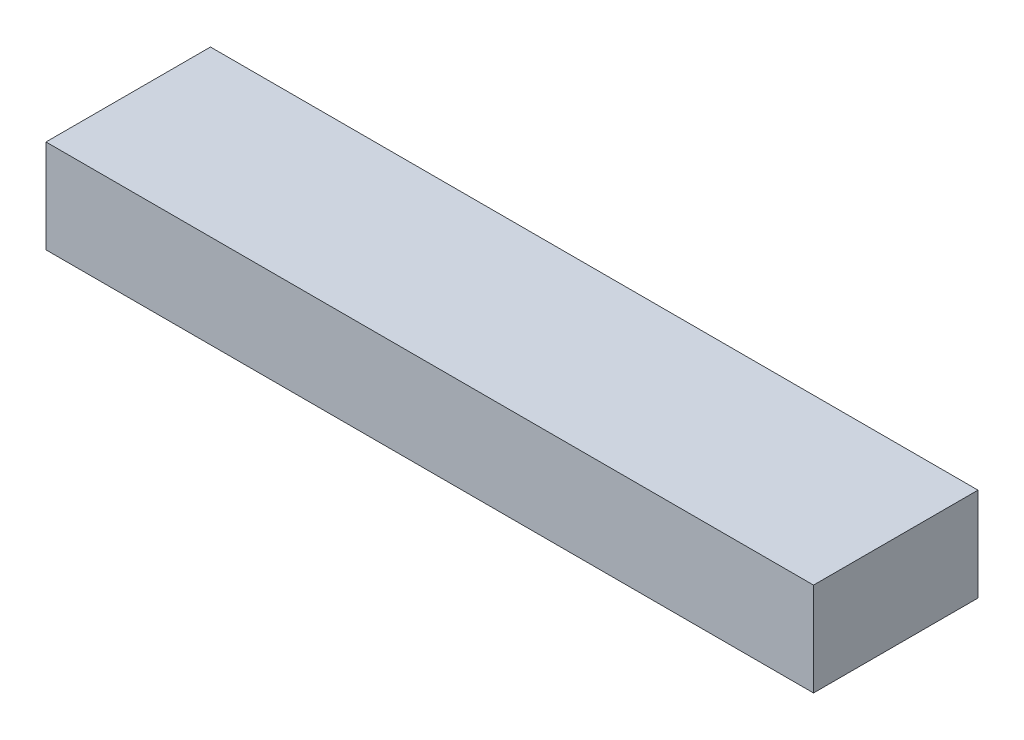
ISO-10303-21;
HEADER;
FILE_DESCRIPTION(('STEP AP214'),'2;1');
FILE_NAME('part.step','',(''),(''),'','','');
FILE_SCHEMA(('AUTOMOTIVE_DESIGN { 1 0 10303 214 1 1 1 1 }'));
ENDSEC;
DATA;
#1=APPLICATION_CONTEXT('core data for automotive mechanical design processes');
#2=APPLICATION_PROTOCOL_DEFINITION('international standard','automotive_design',2000,#1);
#3=PRODUCT_CONTEXT('',#1,'mechanical');
#4=PRODUCT('Part','Part','',(#3));
#5=PRODUCT_RELATED_PRODUCT_CATEGORY('part','',(#4));
#6=PRODUCT_DEFINITION_FORMATION('','',#4);
#7=PRODUCT_DEFINITION_CONTEXT('part definition',#1,'design');
#8=PRODUCT_DEFINITION('design','',#6,#7);
#9=PRODUCT_DEFINITION_SHAPE('','',#8);
#10=(LENGTH_UNIT() NAMED_UNIT(*) SI_UNIT(.MILLI.,.METRE.));
#11=(NAMED_UNIT(*) PLANE_ANGLE_UNIT() SI_UNIT($,.RADIAN.));
#12=(NAMED_UNIT(*) SI_UNIT($,.STERADIAN.) SOLID_ANGLE_UNIT());
#13=UNCERTAINTY_MEASURE_WITH_UNIT(LENGTH_MEASURE(1.E-05),#10,'distance_accuracy_value','');
#14=(GEOMETRIC_REPRESENTATION_CONTEXT(3) GLOBAL_UNCERTAINTY_ASSIGNED_CONTEXT((#13)) GLOBAL_UNIT_ASSIGNED_CONTEXT((#10,
#11,#12)) REPRESENTATION_CONTEXT('',''));
#15=CARTESIAN_POINT('',(0.,0.,0.));
#16=DIRECTION('',(0.,0.,1.));
#17=DIRECTION('',(1.,0.,0.));
#18=AXIS2_PLACEMENT_3D('',#15,#16,#17);
#19=CARTESIAN_POINT('',(355.6,0.,76.2));
#20=DIRECTION('',(0.,1.,0.));
#21=DIRECTION('',(-1.,0.,0.));
#22=AXIS2_PLACEMENT_3D('',#19,#20,#21);
#23=PLANE('',#22);
#24=DIRECTION('',(1.,0.,0.));
#25=VECTOR('',#24,1.);
#26=CARTESIAN_POINT('',(355.6,0.,0.));
#27=LINE('',#26,#25);
#28=CARTESIAN_POINT('',(0.,0.,0.));
#29=VERTEX_POINT('',#28);
#30=CARTESIAN_POINT('',(355.6,0.,0.));
#31=VERTEX_POINT('',#30);
#32=EDGE_CURVE('E100',#29,#31,#27,.T.);
#33=ORIENTED_EDGE('',*,*,#32,.T.);
#34=DIRECTION('',(0.,0.,-1.));
#35=VECTOR('',#34,1.);
#36=CARTESIAN_POINT('',(355.6,0.,76.2));
#37=LINE('',#36,#35);
#38=CARTESIAN_POINT('',(355.6,0.,76.2));
#39=VERTEX_POINT('',#38);
#40=EDGE_CURVE('E11',#39,#31,#37,.T.);
#41=ORIENTED_EDGE('',*,*,#40,.F.);
#42=DIRECTION('',(1.,0.,0.));
#43=VECTOR('',#42,1.);
#44=CARTESIAN_POINT('',(355.6,0.,76.2));
#45=LINE('',#44,#43);
#46=CARTESIAN_POINT('',(0.,0.,76.2));
#47=VERTEX_POINT('',#46);
#48=EDGE_CURVE('E88',#47,#39,#45,.T.);
#49=ORIENTED_EDGE('',*,*,#48,.F.);
#50=DIRECTION('',(0.,0.,-1.));
#51=VECTOR('',#50,1.);
#52=CARTESIAN_POINT('',(0.,0.,76.2));
#53=LINE('',#52,#51);
#54=EDGE_CURVE('E96',#47,#29,#53,.T.);
#55=ORIENTED_EDGE('',*,*,#54,.T.);
#56=EDGE_LOOP('',(#33,#41,#49,#55));
#57=FACE_BOUND('',#56,.T.);
#58=ADVANCED_FACE('F37',(#57),#23,.F.);
#59=CARTESIAN_POINT('',(355.6,43.2998132865615,76.2));
#60=DIRECTION('',(-1.,0.,0.));
#61=DIRECTION('',(0.,-1.,0.));
#62=AXIS2_PLACEMENT_3D('',#59,#60,#61);
#63=PLANE('',#62);
#64=DIRECTION('',(0.,1.,0.));
#65=VECTOR('',#64,1.);
#66=CARTESIAN_POINT('',(355.6,43.2998132865615,0.));
#67=LINE('',#66,#65);
#68=CARTESIAN_POINT('',(355.6,43.2998132865615,0.));
#69=VERTEX_POINT('',#68);
#70=EDGE_CURVE('E92',#31,#69,#67,.T.);
#71=ORIENTED_EDGE('',*,*,#70,.T.);
#72=DIRECTION('',(0.,0.,-1.));
#73=VECTOR('',#72,1.);
#74=CARTESIAN_POINT('',(355.6,43.2998132865615,76.2));
#75=LINE('',#74,#73);
#76=CARTESIAN_POINT('',(355.6,43.2998132865615,76.2));
#77=VERTEX_POINT('',#76);
#78=EDGE_CURVE('E45',#77,#69,#75,.T.);
#79=ORIENTED_EDGE('',*,*,#78,.F.);
#80=DIRECTION('',(0.,1.,0.));
#81=VECTOR('',#80,1.);
#82=CARTESIAN_POINT('',(355.6,43.2998132865615,76.2));
#83=LINE('',#82,#81);
#84=EDGE_CURVE('E83',#39,#77,#83,.T.);
#85=ORIENTED_EDGE('',*,*,#84,.F.);
#86=ORIENTED_EDGE('',*,*,#40,.T.);
#87=EDGE_LOOP('',(#71,#79,#85,#86));
#88=FACE_BOUND('',#87,.T.);
#89=ADVANCED_FACE('F91',(#88),#63,.F.);
#90=CARTESIAN_POINT('',(0.,43.2998132865615,76.2));
#91=DIRECTION('',(0.,-1.,0.));
#92=DIRECTION('',(0.,0.,-1.));
#93=AXIS2_PLACEMENT_3D('',#90,#91,#92);
#94=PLANE('',#93);
#95=DIRECTION('',(-1.,0.,0.));
#96=VECTOR('',#95,1.);
#97=CARTESIAN_POINT('',(0.,43.2998132865615,0.));
#98=LINE('',#97,#96);
#99=CARTESIAN_POINT('',(0.,43.2998132865615,0.));
#100=VERTEX_POINT('',#99);
#101=EDGE_CURVE('E70',#69,#100,#98,.T.);
#102=ORIENTED_EDGE('',*,*,#101,.T.);
#103=DIRECTION('',(0.,0.,-1.));
#104=VECTOR('',#103,1.);
#105=CARTESIAN_POINT('',(0.,43.2998132865615,76.2));
#106=LINE('',#105,#104);
#107=CARTESIAN_POINT('',(0.,43.2998132865615,76.2));
#108=VERTEX_POINT('',#107);
#109=EDGE_CURVE('E93',#108,#100,#106,.T.);
#110=ORIENTED_EDGE('',*,*,#109,.F.);
#111=DIRECTION('',(-1.,0.,0.));
#112=VECTOR('',#111,1.);
#113=CARTESIAN_POINT('',(0.,43.2998132865615,76.2));
#114=LINE('',#113,#112);
#115=EDGE_CURVE('E86',#77,#108,#114,.T.);
#116=ORIENTED_EDGE('',*,*,#115,.F.);
#117=ORIENTED_EDGE('',*,*,#78,.T.);
#118=EDGE_LOOP('',(#102,#110,#116,#117));
#119=FACE_BOUND('',#118,.T.);
#120=ADVANCED_FACE('F94',(#119),#94,.F.);
#121=CARTESIAN_POINT('',(0.,0.,76.2));
#122=DIRECTION('',(1.,0.,0.));
#123=DIRECTION('',(0.,0.,-1.));
#124=AXIS2_PLACEMENT_3D('',#121,#122,#123);
#125=PLANE('',#124);
#126=DIRECTION('',(0.,-1.,0.));
#127=VECTOR('',#126,1.);
#128=CARTESIAN_POINT('',(0.,0.,0.));
#129=LINE('',#128,#127);
#130=EDGE_CURVE('E76',#100,#29,#129,.T.);
#131=ORIENTED_EDGE('',*,*,#130,.T.);
#132=ORIENTED_EDGE('',*,*,#54,.F.);
#133=DIRECTION('',(0.,-1.,0.));
#134=VECTOR('',#133,1.);
#135=CARTESIAN_POINT('',(0.,0.,76.2));
#136=LINE('',#135,#134);
#137=EDGE_CURVE('E53',#108,#47,#136,.T.);
#138=ORIENTED_EDGE('',*,*,#137,.F.);
#139=ORIENTED_EDGE('',*,*,#109,.T.);
#140=EDGE_LOOP('',(#131,#132,#138,#139));
#141=FACE_BOUND('',#140,.T.);
#142=ADVANCED_FACE('F107',(#141),#125,.F.);
#143=CARTESIAN_POINT('',(0.,0.,76.2));
#144=DIRECTION('',(0.,0.,-1.));
#145=DIRECTION('',(-1.,0.,0.));
#146=AXIS2_PLACEMENT_3D('',#143,#144,#145);
#147=PLANE('',#146);
#148=ORIENTED_EDGE('',*,*,#48,.T.);
#149=ORIENTED_EDGE('',*,*,#84,.T.);
#150=ORIENTED_EDGE('',*,*,#115,.T.);
#151=ORIENTED_EDGE('',*,*,#137,.T.);
#152=EDGE_LOOP('',(#148,#149,#150,#151));
#153=FACE_BOUND('',#152,.T.);
#154=ADVANCED_FACE('F84',(#153),#147,.F.);
#155=CARTESIAN_POINT('',(0.,0.,0.));
#156=DIRECTION('',(0.,0.,-1.));
#157=DIRECTION('',(-1.,0.,0.));
#158=AXIS2_PLACEMENT_3D('',#155,#156,#157);
#159=PLANE('',#158);
#160=ORIENTED_EDGE('',*,*,#32,.F.);
#161=ORIENTED_EDGE('',*,*,#130,.F.);
#162=ORIENTED_EDGE('',*,*,#101,.F.);
#163=ORIENTED_EDGE('',*,*,#70,.F.);
#164=EDGE_LOOP('',(#160,#161,#162,#163));
#165=FACE_BOUND('',#164,.T.);
#166=ADVANCED_FACE('F110',(#165),#159,.T.);
#167=CLOSED_SHELL('',(#58,#89,#120,#142,#154,#166));
#168=MANIFOLD_SOLID_BREP('B2',#167);
#169=ADVANCED_BREP_SHAPE_REPRESENTATION('',(#18,#168),#14);
#170=SHAPE_DEFINITION_REPRESENTATION(#9,#169);
ENDSEC;
END-ISO-10303-21;
